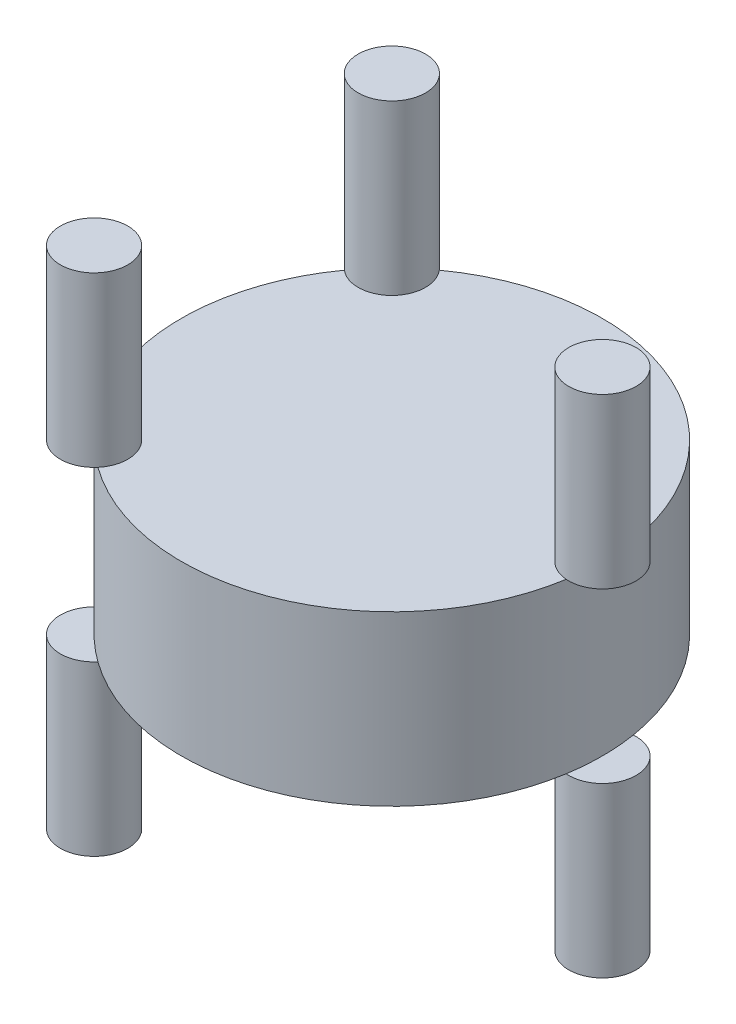
ISO-10303-21;
HEADER;
FILE_DESCRIPTION(('STEP AP214'),'2;1');
FILE_NAME('part.step','',(''),(''),'','','');
FILE_SCHEMA(('AUTOMOTIVE_DESIGN { 1 0 10303 214 1 1 1 1 }'));
ENDSEC;
DATA;
#1=APPLICATION_CONTEXT('core data for automotive mechanical design processes');
#2=APPLICATION_PROTOCOL_DEFINITION('international standard','automotive_design',2000,#1);
#3=PRODUCT_CONTEXT('',#1,'mechanical');
#4=PRODUCT('Part','Part','',(#3));
#5=PRODUCT_RELATED_PRODUCT_CATEGORY('part','',(#4));
#6=PRODUCT_DEFINITION_FORMATION('','',#4);
#7=PRODUCT_DEFINITION_CONTEXT('part definition',#1,'design');
#8=PRODUCT_DEFINITION('design','',#6,#7);
#9=PRODUCT_DEFINITION_SHAPE('','',#8);
#10=(LENGTH_UNIT() NAMED_UNIT(*) SI_UNIT(.MILLI.,.METRE.));
#11=(NAMED_UNIT(*) PLANE_ANGLE_UNIT() SI_UNIT($,.RADIAN.));
#12=(NAMED_UNIT(*) SI_UNIT($,.STERADIAN.) SOLID_ANGLE_UNIT());
#13=UNCERTAINTY_MEASURE_WITH_UNIT(LENGTH_MEASURE(1.E-05),#10,'distance_accuracy_value','');
#14=(GEOMETRIC_REPRESENTATION_CONTEXT(3) GLOBAL_UNCERTAINTY_ASSIGNED_CONTEXT((#13)) GLOBAL_UNIT_ASSIGNED_CONTEXT((#10,
#11,#12)) REPRESENTATION_CONTEXT('',''));
#15=CARTESIAN_POINT('',(0.,0.,0.));
#16=DIRECTION('',(0.,0.,1.));
#17=DIRECTION('',(1.,0.,0.));
#18=AXIS2_PLACEMENT_3D('',#15,#16,#17);
#19=CARTESIAN_POINT('',(0.,10.,0.));
#20=DIRECTION('',(0.,-1.,0.));
#21=DIRECTION('',(0.,0.,-1.));
#22=AXIS2_PLACEMENT_3D('',#19,#20,#21);
#23=CYLINDRICAL_SURFACE('',#22,12.5);
#24=CARTESIAN_POINT('',(0.,10.,0.));
#25=DIRECTION('',(0.,1.,0.));
#26=DIRECTION('',(0.,0.,1.));
#27=AXIS2_PLACEMENT_3D('',#24,#25,#26);
#28=CIRCLE('',#27,12.5);
#29=CARTESIAN_POINT('',(-7.31601686490556,10.,-10.1353784947784));
#30=VERTEX_POINT('',#29);
#31=CARTESIAN_POINT('',(-10.1353784947785,10.,-7.31601686490545));
#32=VERTEX_POINT('',#31);
#33=EDGE_CURVE('E167',#30,#32,#28,.T.);
#34=ORIENTED_EDGE('',*,*,#33,.F.);
#35=CARTESIAN_POINT('',(12.34,10.,-1.99358972710035));
#36=VERTEX_POINT('',#35);
#37=EDGE_CURVE('E171',#36,#30,#28,.T.);
#38=ORIENTED_EDGE('',*,*,#37,.F.);
#39=CARTESIAN_POINT('',(12.34,10.,1.99358972710033));
#40=VERTEX_POINT('',#39);
#41=EDGE_CURVE('E177',#40,#36,#28,.T.);
#42=ORIENTED_EDGE('',*,*,#41,.F.);
#43=CARTESIAN_POINT('',(-7.31601686490556,10.,10.1353784947784));
#44=VERTEX_POINT('',#43);
#45=EDGE_CURVE('E269',#44,#40,#28,.T.);
#46=ORIENTED_EDGE('',*,*,#45,.F.);
#47=CARTESIAN_POINT('',(-10.1353784947785,10.,7.31601686490545));
#48=VERTEX_POINT('',#47);
#49=EDGE_CURVE('E273',#48,#44,#28,.T.);
#50=ORIENTED_EDGE('',*,*,#49,.F.);
#51=EDGE_CURVE('E170',#32,#48,#28,.T.);
#52=ORIENTED_EDGE('',*,*,#51,.F.);
#53=EDGE_LOOP('',(#34,#38,#42,#46,#50,#52));
#54=FACE_BOUND('',#53,.T.);
#55=CARTESIAN_POINT('',(0.,0.,0.));
#56=DIRECTION('',(0.,1.,0.));
#57=DIRECTION('',(0.,0.,1.));
#58=AXIS2_PLACEMENT_3D('',#55,#56,#57);
#59=CIRCLE('',#58,12.5);
#60=CARTESIAN_POINT('',(-7.31601686490557,0.,-10.1353784947784));
#61=VERTEX_POINT('',#60);
#62=CARTESIAN_POINT('',(-10.1353784947785,0.,-7.31601686490544));
#63=VERTEX_POINT('',#62);
#64=EDGE_CURVE('E115',#61,#63,#59,.T.);
#65=ORIENTED_EDGE('',*,*,#64,.T.);
#66=CARTESIAN_POINT('',(-10.1353784947785,0.,7.31601686490544));
#67=VERTEX_POINT('',#66);
#68=EDGE_CURVE('E173',#63,#67,#59,.T.);
#69=ORIENTED_EDGE('',*,*,#68,.T.);
#70=CARTESIAN_POINT('',(-7.31601686490557,0.,10.1353784947784));
#71=VERTEX_POINT('',#70);
#72=EDGE_CURVE('E178',#67,#71,#59,.T.);
#73=ORIENTED_EDGE('',*,*,#72,.T.);
#74=CARTESIAN_POINT('',(12.34,0.,1.99358972710034));
#75=VERTEX_POINT('',#74);
#76=EDGE_CURVE('E103',#71,#75,#59,.T.);
#77=ORIENTED_EDGE('',*,*,#76,.T.);
#78=CARTESIAN_POINT('',(12.34,0.,-1.99358972710034));
#79=VERTEX_POINT('',#78);
#80=EDGE_CURVE('E99',#75,#79,#59,.T.);
#81=ORIENTED_EDGE('',*,*,#80,.T.);
#82=EDGE_CURVE('E100',#79,#61,#59,.T.);
#83=ORIENTED_EDGE('',*,*,#82,.T.);
#84=EDGE_LOOP('',(#65,#69,#73,#77,#81,#83));
#85=FACE_BOUND('',#84,.T.);
#86=ADVANCED_FACE('F45',(#54,#85),#23,.T.);
#87=CARTESIAN_POINT('',(0.,10.,0.));
#88=DIRECTION('',(0.,1.,0.));
#89=DIRECTION('',(0.,0.,1.));
#90=AXIS2_PLACEMENT_3D('',#87,#88,#89);
#91=PLANE('',#90);
#92=ORIENTED_EDGE('',*,*,#45,.T.);
#93=CARTESIAN_POINT('',(12.5,10.,0.));
#94=DIRECTION('',(0.,1.,0.));
#95=DIRECTION('',(0.,0.,1.));
#96=AXIS2_PLACEMENT_3D('',#93,#94,#95);
#97=CIRCLE('',#96,2.);
#98=EDGE_CURVE('E149',#36,#40,#97,.T.);
#99=ORIENTED_EDGE('',*,*,#98,.F.);
#100=ORIENTED_EDGE('',*,*,#37,.T.);
#101=CARTESIAN_POINT('',(-8.83883476483189,10.,-8.83883476483179));
#102=DIRECTION('',(0.,1.,0.));
#103=DIRECTION('',(0.,0.,1.));
#104=AXIS2_PLACEMENT_3D('',#101,#102,#103);
#105=CIRCLE('',#104,2.);
#106=EDGE_CURVE('E53',#32,#30,#105,.T.);
#107=ORIENTED_EDGE('',*,*,#106,.F.);
#108=ORIENTED_EDGE('',*,*,#51,.T.);
#109=CARTESIAN_POINT('',(-8.83883476483189,10.,8.83883476483179));
#110=DIRECTION('',(0.,1.,0.));
#111=DIRECTION('',(0.,0.,1.));
#112=AXIS2_PLACEMENT_3D('',#109,#110,#111);
#113=CIRCLE('',#112,2.);
#114=EDGE_CURVE('E11',#44,#48,#113,.T.);
#115=ORIENTED_EDGE('',*,*,#114,.F.);
#116=EDGE_LOOP('',(#92,#99,#100,#107,#108,#115));
#117=FACE_BOUND('',#116,.T.);
#118=ADVANCED_FACE('F211',(#117),#91,.T.);
#119=CARTESIAN_POINT('',(0.,0.,0.));
#120=DIRECTION('',(0.,1.,0.));
#121=DIRECTION('',(0.,0.,1.));
#122=AXIS2_PLACEMENT_3D('',#119,#120,#121);
#123=PLANE('',#122);
#124=CARTESIAN_POINT('',(12.5,0.,0.));
#125=DIRECTION('',(0.,-1.,0.));
#126=DIRECTION('',(0.,0.,-1.));
#127=AXIS2_PLACEMENT_3D('',#124,#125,#126);
#128=CIRCLE('',#127,2.);
#129=EDGE_CURVE('E60',#75,#79,#128,.T.);
#130=ORIENTED_EDGE('',*,*,#129,.F.);
#131=ORIENTED_EDGE('',*,*,#76,.F.);
#132=CARTESIAN_POINT('',(-8.8388347648319,0.,8.83883476483179));
#133=DIRECTION('',(0.,1.,0.));
#134=DIRECTION('',(0.,0.,1.));
#135=AXIS2_PLACEMENT_3D('',#132,#133,#134);
#136=CIRCLE('',#135,2.);
#137=EDGE_CURVE('E133',#71,#67,#136,.T.);
#138=ORIENTED_EDGE('',*,*,#137,.T.);
#139=ORIENTED_EDGE('',*,*,#68,.F.);
#140=CARTESIAN_POINT('',(-8.8388347648319,0.,-8.83883476483179));
#141=DIRECTION('',(0.,-1.,0.));
#142=DIRECTION('',(0.,0.,-1.));
#143=AXIS2_PLACEMENT_3D('',#140,#141,#142);
#144=CIRCLE('',#143,2.);
#145=EDGE_CURVE('E111',#61,#63,#144,.T.);
#146=ORIENTED_EDGE('',*,*,#145,.F.);
#147=ORIENTED_EDGE('',*,*,#82,.F.);
#148=EDGE_LOOP('',(#130,#131,#138,#139,#146,#147));
#149=FACE_BOUND('',#148,.T.);
#150=ADVANCED_FACE('F108',(#149),#123,.F.);
#151=CARTESIAN_POINT('',(-8.83883476483189,10.,-8.83883476483179));
#152=DIRECTION('',(0.,1.,0.));
#153=DIRECTION('',(0.,0.,1.));
#154=AXIS2_PLACEMENT_3D('',#151,#152,#153);
#155=PLANE('',#154);
#156=EDGE_CURVE('E157',#30,#32,#105,.T.);
#157=ORIENTED_EDGE('',*,*,#156,.F.);
#158=ORIENTED_EDGE('',*,*,#33,.T.);
#159=EDGE_LOOP('',(#157,#158));
#160=FACE_BOUND('',#159,.T.);
#161=ADVANCED_FACE('F231',(#160),#155,.F.);
#162=CARTESIAN_POINT('',(-8.83883476483189,20.,-8.83883476483179));
#163=DIRECTION('',(0.,-1.,0.));
#164=DIRECTION('',(0.,0.,-1.));
#165=AXIS2_PLACEMENT_3D('',#162,#163,#164);
#166=CYLINDRICAL_SURFACE('',#165,2.);
#167=CARTESIAN_POINT('',(-8.83883476483189,20.,-8.83883476483179));
#168=DIRECTION('',(0.,1.,0.));
#169=DIRECTION('',(0.,0.,1.));
#170=AXIS2_PLACEMENT_3D('',#167,#168,#169);
#171=CIRCLE('',#170,2.);
#172=CARTESIAN_POINT('',(-8.83883476483189,20.,-6.8388347648318));
#173=VERTEX_POINT('',#172);
#174=EDGE_CURVE('E114',#173,#173,#171,.T.);
#175=ORIENTED_EDGE('',*,*,#174,.F.);
#176=EDGE_LOOP('',(#175));
#177=FACE_BOUND('',#176,.T.);
#178=ORIENTED_EDGE('',*,*,#156,.T.);
#179=ORIENTED_EDGE('',*,*,#106,.T.);
#180=EDGE_LOOP('',(#178,#179));
#181=FACE_BOUND('',#180,.T.);
#182=ADVANCED_FACE('F229',(#177,#181),#166,.T.);
#183=CARTESIAN_POINT('',(-8.83883476483189,20.,-8.83883476483179));
#184=DIRECTION('',(0.,1.,0.));
#185=DIRECTION('',(0.,0.,1.));
#186=AXIS2_PLACEMENT_3D('',#183,#184,#185);
#187=PLANE('',#186);
#188=ORIENTED_EDGE('',*,*,#174,.T.);
#189=EDGE_LOOP('',(#188));
#190=FACE_BOUND('',#189,.T.);
#191=ADVANCED_FACE('F237',(#190),#187,.T.);
#192=CARTESIAN_POINT('',(-8.83883476483189,20.,8.83883476483179));
#193=DIRECTION('',(0.,-1.,0.));
#194=DIRECTION('',(0.,0.,-1.));
#195=AXIS2_PLACEMENT_3D('',#192,#193,#194);
#196=CYLINDRICAL_SURFACE('',#195,2.);
#197=CARTESIAN_POINT('',(-8.83883476483189,20.,8.83883476483179));
#198=DIRECTION('',(0.,-1.,0.));
#199=DIRECTION('',(0.,0.,-1.));
#200=AXIS2_PLACEMENT_3D('',#197,#198,#199);
#201=CIRCLE('',#200,2.);
#202=CARTESIAN_POINT('',(-8.83883476483189,20.,6.8388347648318));
#203=VERTEX_POINT('',#202);
#204=EDGE_CURVE('E153',#203,#203,#201,.T.);
#205=ORIENTED_EDGE('',*,*,#204,.T.);
#206=EDGE_LOOP('',(#205));
#207=FACE_BOUND('',#206,.T.);
#208=CARTESIAN_POINT('',(-8.83883476483189,10.,8.83883476483179));
#209=DIRECTION('',(0.,-1.,0.));
#210=DIRECTION('',(0.,0.,-1.));
#211=AXIS2_PLACEMENT_3D('',#208,#209,#210);
#212=CIRCLE('',#211,2.);
#213=EDGE_CURVE('E148',#44,#48,#212,.T.);
#214=ORIENTED_EDGE('',*,*,#213,.F.);
#215=ORIENTED_EDGE('',*,*,#114,.T.);
#216=EDGE_LOOP('',(#214,#215));
#217=FACE_BOUND('',#216,.T.);
#218=ADVANCED_FACE('F243',(#207,#217),#196,.T.);
#219=CARTESIAN_POINT('',(-8.83883476483189,20.,8.83883476483179));
#220=DIRECTION('',(0.,1.,0.));
#221=DIRECTION('',(0.,0.,-1.));
#222=AXIS2_PLACEMENT_3D('',#219,#220,#221);
#223=PLANE('',#222);
#224=ORIENTED_EDGE('',*,*,#204,.F.);
#225=EDGE_LOOP('',(#224));
#226=FACE_BOUND('',#225,.T.);
#227=ADVANCED_FACE('F247',(#226),#223,.T.);
#228=CARTESIAN_POINT('',(-8.83883476483189,10.,8.83883476483179));
#229=DIRECTION('',(0.,1.,0.));
#230=DIRECTION('',(0.,0.,-1.));
#231=AXIS2_PLACEMENT_3D('',#228,#229,#230);
#232=PLANE('',#231);
#233=ORIENTED_EDGE('',*,*,#213,.T.);
#234=ORIENTED_EDGE('',*,*,#49,.T.);
#235=EDGE_LOOP('',(#233,#234));
#236=FACE_BOUND('',#235,.T.);
#237=ADVANCED_FACE('F249',(#236),#232,.F.);
#238=CARTESIAN_POINT('',(12.5,20.,0.));
#239=DIRECTION('',(0.,-1.,0.));
#240=DIRECTION('',(0.,0.,-1.));
#241=AXIS2_PLACEMENT_3D('',#238,#239,#240);
#242=CYLINDRICAL_SURFACE('',#241,2.);
#243=CARTESIAN_POINT('',(12.5,20.,0.));
#244=DIRECTION('',(0.,1.,0.));
#245=DIRECTION('',(0.,0.,1.));
#246=AXIS2_PLACEMENT_3D('',#243,#244,#245);
#247=CIRCLE('',#246,2.);
#248=CARTESIAN_POINT('',(12.5,20.,1.99999999999999));
#249=VERTEX_POINT('',#248);
#250=EDGE_CURVE('E144',#249,#249,#247,.T.);
#251=ORIENTED_EDGE('',*,*,#250,.F.);
#252=EDGE_LOOP('',(#251));
#253=FACE_BOUND('',#252,.T.);
#254=ORIENTED_EDGE('',*,*,#98,.T.);
#255=EDGE_CURVE('E141',#40,#36,#97,.T.);
#256=ORIENTED_EDGE('',*,*,#255,.T.);
#257=EDGE_LOOP('',(#254,#256));
#258=FACE_BOUND('',#257,.T.);
#259=ADVANCED_FACE('F252',(#253,#258),#242,.T.);
#260=CARTESIAN_POINT('',(12.5,20.,0.));
#261=DIRECTION('',(0.,1.,0.));
#262=DIRECTION('',(0.,0.,1.));
#263=AXIS2_PLACEMENT_3D('',#260,#261,#262);
#264=PLANE('',#263);
#265=ORIENTED_EDGE('',*,*,#250,.T.);
#266=EDGE_LOOP('',(#265));
#267=FACE_BOUND('',#266,.T.);
#268=ADVANCED_FACE('F204',(#267),#264,.T.);
#269=CARTESIAN_POINT('',(12.5,10.,0.));
#270=DIRECTION('',(0.,1.,0.));
#271=DIRECTION('',(0.,0.,1.));
#272=AXIS2_PLACEMENT_3D('',#269,#270,#271);
#273=PLANE('',#272);
#274=ORIENTED_EDGE('',*,*,#255,.F.);
#275=ORIENTED_EDGE('',*,*,#41,.T.);
#276=EDGE_LOOP('',(#274,#275));
#277=FACE_BOUND('',#276,.T.);
#278=ADVANCED_FACE('F195',(#277),#273,.F.);
#279=CARTESIAN_POINT('',(-8.8388347648319,-10.,-8.83883476483179));
#280=DIRECTION('',(0.,1.,0.));
#281=DIRECTION('',(0.,0.,1.));
#282=AXIS2_PLACEMENT_3D('',#279,#280,#281);
#283=CYLINDRICAL_SURFACE('',#282,2.);
#284=CARTESIAN_POINT('',(-8.8388347648319,-10.,-8.83883476483179));
#285=DIRECTION('',(0.,-1.,0.));
#286=DIRECTION('',(0.,0.,-1.));
#287=AXIS2_PLACEMENT_3D('',#284,#285,#286);
#288=CIRCLE('',#287,2.);
#289=CARTESIAN_POINT('',(-8.8388347648319,-10.,-10.8388347648318));
#290=VERTEX_POINT('',#289);
#291=EDGE_CURVE('E137',#290,#290,#288,.T.);
#292=ORIENTED_EDGE('',*,*,#291,.F.);
#293=EDGE_LOOP('',(#292));
#294=FACE_BOUND('',#293,.T.);
#295=ORIENTED_EDGE('',*,*,#145,.T.);
#296=EDGE_CURVE('E132',#63,#61,#144,.T.);
#297=ORIENTED_EDGE('',*,*,#296,.T.);
#298=EDGE_LOOP('',(#295,#297));
#299=FACE_BOUND('',#298,.T.);
#300=ADVANCED_FACE('F192',(#294,#299),#283,.T.);
#301=CARTESIAN_POINT('',(-8.8388347648319,-10.,-8.83883476483179));
#302=DIRECTION('',(0.,-1.,0.));
#303=DIRECTION('',(0.,0.,-1.));
#304=AXIS2_PLACEMENT_3D('',#301,#302,#303);
#305=PLANE('',#304);
#306=ORIENTED_EDGE('',*,*,#291,.T.);
#307=EDGE_LOOP('',(#306));
#308=FACE_BOUND('',#307,.T.);
#309=ADVANCED_FACE('F194',(#308),#305,.T.);
#310=CARTESIAN_POINT('',(-8.8388347648319,0.,-8.83883476483179));
#311=DIRECTION('',(0.,-1.,0.));
#312=DIRECTION('',(0.,0.,-1.));
#313=AXIS2_PLACEMENT_3D('',#310,#311,#312);
#314=PLANE('',#313);
#315=ORIENTED_EDGE('',*,*,#64,.F.);
#316=ORIENTED_EDGE('',*,*,#296,.F.);
#317=EDGE_LOOP('',(#315,#316));
#318=FACE_BOUND('',#317,.T.);
#319=ADVANCED_FACE('F190',(#318),#314,.F.);
#320=CARTESIAN_POINT('',(-8.8388347648319,-10.,8.83883476483179));
#321=DIRECTION('',(0.,1.,0.));
#322=DIRECTION('',(0.,0.,1.));
#323=AXIS2_PLACEMENT_3D('',#320,#321,#322);
#324=CYLINDRICAL_SURFACE('',#323,2.);
#325=CARTESIAN_POINT('',(-8.8388347648319,-10.,8.83883476483179));
#326=DIRECTION('',(0.,1.,0.));
#327=DIRECTION('',(0.,0.,1.));
#328=AXIS2_PLACEMENT_3D('',#325,#326,#327);
#329=CIRCLE('',#328,2.);
#330=CARTESIAN_POINT('',(-8.8388347648319,-10.,10.8388347648318));
#331=VERTEX_POINT('',#330);
#332=EDGE_CURVE('E128',#331,#331,#329,.T.);
#333=ORIENTED_EDGE('',*,*,#332,.T.);
#334=EDGE_LOOP('',(#333));
#335=FACE_BOUND('',#334,.T.);
#336=ORIENTED_EDGE('',*,*,#137,.F.);
#337=EDGE_CURVE('E67',#67,#71,#136,.T.);
#338=ORIENTED_EDGE('',*,*,#337,.F.);
#339=EDGE_LOOP('',(#336,#338));
#340=FACE_BOUND('',#339,.T.);
#341=ADVANCED_FACE('F187',(#335,#340),#324,.T.);
#342=CARTESIAN_POINT('',(-8.8388347648319,-10.,8.83883476483179));
#343=DIRECTION('',(0.,-1.,0.));
#344=DIRECTION('',(0.,0.,1.));
#345=AXIS2_PLACEMENT_3D('',#342,#343,#344);
#346=PLANE('',#345);
#347=ORIENTED_EDGE('',*,*,#332,.F.);
#348=EDGE_LOOP('',(#347));
#349=FACE_BOUND('',#348,.T.);
#350=ADVANCED_FACE('F312',(#349),#346,.T.);
#351=CARTESIAN_POINT('',(-8.8388347648319,0.,8.83883476483179));
#352=DIRECTION('',(0.,-1.,0.));
#353=DIRECTION('',(0.,0.,1.));
#354=AXIS2_PLACEMENT_3D('',#351,#352,#353);
#355=PLANE('',#354);
#356=ORIENTED_EDGE('',*,*,#337,.T.);
#357=ORIENTED_EDGE('',*,*,#72,.F.);
#358=EDGE_LOOP('',(#356,#357));
#359=FACE_BOUND('',#358,.T.);
#360=ADVANCED_FACE('F186',(#359),#355,.F.);
#361=CARTESIAN_POINT('',(12.5,-10.,0.));
#362=DIRECTION('',(0.,1.,0.));
#363=DIRECTION('',(0.,0.,1.));
#364=AXIS2_PLACEMENT_3D('',#361,#362,#363);
#365=CYLINDRICAL_SURFACE('',#364,2.);
#366=CARTESIAN_POINT('',(12.5,-10.,0.));
#367=DIRECTION('',(0.,-1.,0.));
#368=DIRECTION('',(0.,0.,-1.));
#369=AXIS2_PLACEMENT_3D('',#366,#367,#368);
#370=CIRCLE('',#369,2.);
#371=CARTESIAN_POINT('',(12.5,-10.,-2.));
#372=VERTEX_POINT('',#371);
#373=EDGE_CURVE('E123',#372,#372,#370,.T.);
#374=ORIENTED_EDGE('',*,*,#373,.F.);
#375=EDGE_LOOP('',(#374));
#376=FACE_BOUND('',#375,.T.);
#377=ORIENTED_EDGE('',*,*,#129,.T.);
#378=EDGE_CURVE('E116',#79,#75,#128,.T.);
#379=ORIENTED_EDGE('',*,*,#378,.T.);
#380=EDGE_LOOP('',(#377,#379));
#381=FACE_BOUND('',#380,.T.);
#382=ADVANCED_FACE('F121',(#376,#381),#365,.T.);
#383=CARTESIAN_POINT('',(12.5,-10.,0.));
#384=DIRECTION('',(0.,-1.,0.));
#385=DIRECTION('',(0.,0.,-1.));
#386=AXIS2_PLACEMENT_3D('',#383,#384,#385);
#387=PLANE('',#386);
#388=ORIENTED_EDGE('',*,*,#373,.T.);
#389=EDGE_LOOP('',(#388));
#390=FACE_BOUND('',#389,.T.);
#391=ADVANCED_FACE('F338',(#390),#387,.T.);
#392=CARTESIAN_POINT('',(12.5,0.,0.));
#393=DIRECTION('',(0.,-1.,0.));
#394=DIRECTION('',(0.,0.,-1.));
#395=AXIS2_PLACEMENT_3D('',#392,#393,#394);
#396=PLANE('',#395);
#397=ORIENTED_EDGE('',*,*,#378,.F.);
#398=ORIENTED_EDGE('',*,*,#80,.F.);
#399=EDGE_LOOP('',(#397,#398));
#400=FACE_BOUND('',#399,.T.);
#401=ADVANCED_FACE('F117',(#400),#396,.F.);
#402=CLOSED_SHELL('',(#86,#118,#150,#161,#182,#191,#218,#227,#237,#259,#268,#278,#300,#309,#319,
#341,#350,#360,#382,#391,#401));
#403=MANIFOLD_SOLID_BREP('B2',#402);
#404=ADVANCED_BREP_SHAPE_REPRESENTATION('',(#18,#403),#14);
#405=SHAPE_DEFINITION_REPRESENTATION(#9,#404);
ENDSEC;
END-ISO-10303-21;
